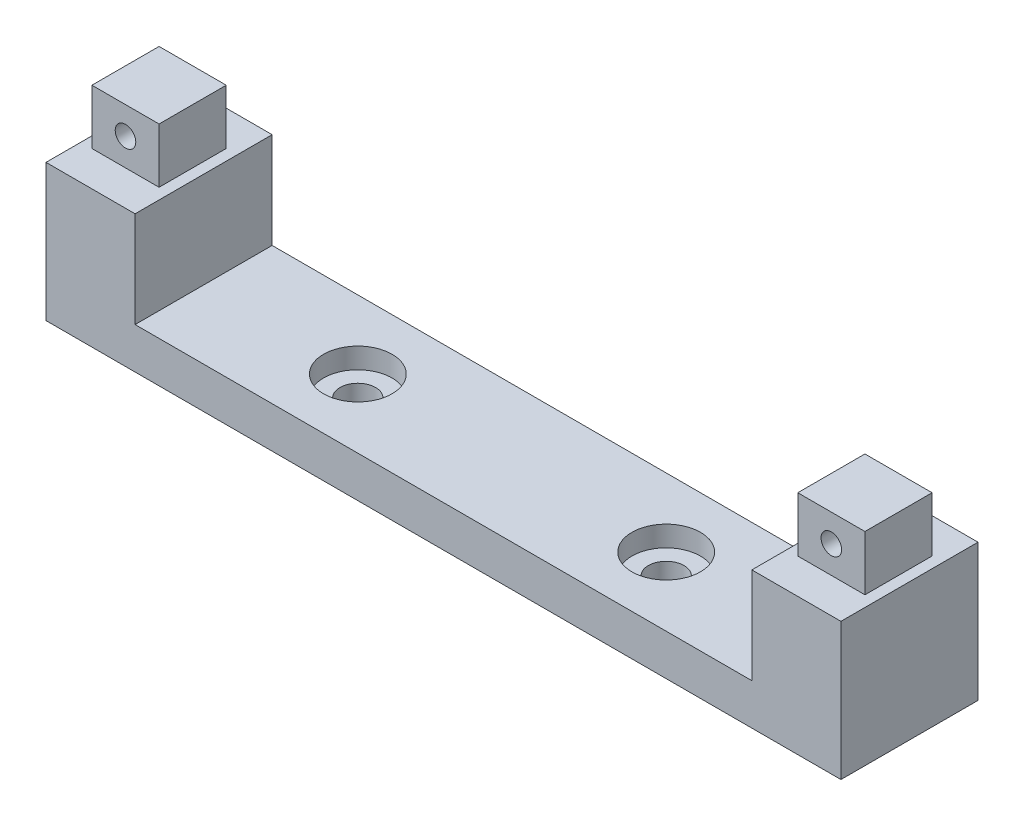
ISO-10303-21;
HEADER;
FILE_DESCRIPTION(('STEP AP214'),'2;1');
FILE_NAME('part.step','',(''),(''),'','','');
FILE_SCHEMA(('AUTOMOTIVE_DESIGN { 1 0 10303 214 1 1 1 1 }'));
ENDSEC;
DATA;
#1=APPLICATION_CONTEXT('core data for automotive mechanical design processes');
#2=APPLICATION_PROTOCOL_DEFINITION('international standard','automotive_design',2000,#1);
#3=PRODUCT_CONTEXT('',#1,'mechanical');
#4=PRODUCT('Part','Part','',(#3));
#5=PRODUCT_RELATED_PRODUCT_CATEGORY('part','',(#4));
#6=PRODUCT_DEFINITION_FORMATION('','',#4);
#7=PRODUCT_DEFINITION_CONTEXT('part definition',#1,'design');
#8=PRODUCT_DEFINITION('design','',#6,#7);
#9=PRODUCT_DEFINITION_SHAPE('','',#8);
#10=(LENGTH_UNIT() NAMED_UNIT(*) SI_UNIT(.MILLI.,.METRE.));
#11=(NAMED_UNIT(*) PLANE_ANGLE_UNIT() SI_UNIT($,.RADIAN.));
#12=(NAMED_UNIT(*) SI_UNIT($,.STERADIAN.) SOLID_ANGLE_UNIT());
#13=UNCERTAINTY_MEASURE_WITH_UNIT(LENGTH_MEASURE(1.E-05),#10,'distance_accuracy_value','');
#14=(GEOMETRIC_REPRESENTATION_CONTEXT(3) GLOBAL_UNCERTAINTY_ASSIGNED_CONTEXT((#13)) GLOBAL_UNIT_ASSIGNED_CONTEXT((#10,
#11,#12)) REPRESENTATION_CONTEXT('',''));
#15=CARTESIAN_POINT('',(0.,0.,0.));
#16=DIRECTION('',(0.,0.,1.));
#17=DIRECTION('',(1.,0.,0.));
#18=AXIS2_PLACEMENT_3D('',#15,#16,#17);
#19=CARTESIAN_POINT('',(-2.50000000000001,-8.,10.));
#20=DIRECTION('',(0.,1.,0.));
#21=DIRECTION('',(0.,0.,1.));
#22=AXIS2_PLACEMENT_3D('',#19,#20,#21);
#23=CYLINDRICAL_SURFACE('',#22,2.6);
#24=CARTESIAN_POINT('',(-2.50000000000001,6.,10.));
#25=DIRECTION('',(0.,-1.,0.));
#26=DIRECTION('',(0.,0.,-1.));
#27=AXIS2_PLACEMENT_3D('',#24,#25,#26);
#28=CIRCLE('',#27,2.6);
#29=CARTESIAN_POINT('',(-2.50000000000001,6.,7.4));
#30=VERTEX_POINT('',#29);
#31=EDGE_CURVE('E261',#30,#30,#28,.T.);
#32=ORIENTED_EDGE('',*,*,#31,.T.);
#33=EDGE_LOOP('',(#32));
#34=FACE_BOUND('',#33,.T.);
#35=CARTESIAN_POINT('',(-2.50000000000001,9.,10.));
#36=DIRECTION('',(0.,1.,0.));
#37=DIRECTION('',(0.,0.,1.));
#38=AXIS2_PLACEMENT_3D('',#35,#36,#37);
#39=CIRCLE('',#38,2.6);
#40=CARTESIAN_POINT('',(-2.50000000000001,9.,12.6));
#41=VERTEX_POINT('',#40);
#42=EDGE_CURVE('E43',#41,#41,#39,.F.);
#43=ORIENTED_EDGE('',*,*,#42,.F.);
#44=EDGE_LOOP('',(#43));
#45=FACE_BOUND('',#44,.T.);
#46=ADVANCED_FACE('F39',(#34,#45),#23,.F.);
#47=CARTESIAN_POINT('',(-47.5,-8.,10.));
#48=DIRECTION('',(0.,1.,0.));
#49=DIRECTION('',(0.,0.,1.));
#50=AXIS2_PLACEMENT_3D('',#47,#48,#49);
#51=CYLINDRICAL_SURFACE('',#50,2.6);
#52=CARTESIAN_POINT('',(-47.5,6.,10.));
#53=DIRECTION('',(0.,-1.,0.));
#54=DIRECTION('',(0.,0.,-1.));
#55=AXIS2_PLACEMENT_3D('',#52,#53,#54);
#56=CIRCLE('',#55,2.6);
#57=CARTESIAN_POINT('',(-47.5,6.,7.4));
#58=VERTEX_POINT('',#57);
#59=EDGE_CURVE('E165',#58,#58,#56,.T.);
#60=ORIENTED_EDGE('',*,*,#59,.T.);
#61=EDGE_LOOP('',(#60));
#62=FACE_BOUND('',#61,.T.);
#63=CARTESIAN_POINT('',(-47.5,9.,10.));
#64=DIRECTION('',(0.,1.,0.));
#65=DIRECTION('',(0.,0.,1.));
#66=AXIS2_PLACEMENT_3D('',#63,#64,#65);
#67=CIRCLE('',#66,2.6);
#68=CARTESIAN_POINT('',(-47.5,9.,12.6));
#69=VERTEX_POINT('',#68);
#70=EDGE_CURVE('E255',#69,#69,#67,.F.);
#71=ORIENTED_EDGE('',*,*,#70,.F.);
#72=EDGE_LOOP('',(#71));
#73=FACE_BOUND('',#72,.T.);
#74=ADVANCED_FACE('F358',(#62,#73),#51,.F.);
#75=CARTESIAN_POINT('',(0.,6.,20.));
#76=DIRECTION('',(0.,0.,-1.));
#77=DIRECTION('',(-1.,0.,0.));
#78=AXIS2_PLACEMENT_3D('',#75,#76,#77);
#79=PLANE('',#78);
#80=DIRECTION('',(-1.,0.,0.));
#81=VECTOR('',#80,1.);
#82=CARTESIAN_POINT('',(0.,6.,20.));
#83=LINE('',#82,#81);
#84=CARTESIAN_POINT('',(33.,6.,20.));
#85=VERTEX_POINT('',#84);
#86=CARTESIAN_POINT('',(-83.,6.,20.));
#87=VERTEX_POINT('',#86);
#88=EDGE_CURVE('E11',#85,#87,#83,.T.);
#89=ORIENTED_EDGE('',*,*,#88,.F.);
#90=DIRECTION('',(0.,1.,0.));
#91=VECTOR('',#90,1.);
#92=CARTESIAN_POINT('',(33.,0.,20.));
#93=LINE('',#92,#91);
#94=CARTESIAN_POINT('',(33.,26.,20.));
#95=VERTEX_POINT('',#94);
#96=EDGE_CURVE('E195',#85,#95,#93,.T.);
#97=ORIENTED_EDGE('',*,*,#96,.T.);
#98=DIRECTION('',(1.,0.,0.));
#99=VECTOR('',#98,1.);
#100=CARTESIAN_POINT('',(0.,26.,20.));
#101=LINE('',#100,#99);
#102=CARTESIAN_POINT('',(20.,26.,20.));
#103=VERTEX_POINT('',#102);
#104=EDGE_CURVE('E204',#103,#95,#101,.T.);
#105=ORIENTED_EDGE('',*,*,#104,.F.);
#106=DIRECTION('',(0.,-1.,0.));
#107=VECTOR('',#106,1.);
#108=CARTESIAN_POINT('',(20.,26.,20.));
#109=LINE('',#108,#107);
#110=CARTESIAN_POINT('',(20.,12.,20.));
#111=VERTEX_POINT('',#110);
#112=EDGE_CURVE('E206',#103,#111,#109,.T.);
#113=ORIENTED_EDGE('',*,*,#112,.T.);
#114=DIRECTION('',(1.,0.,0.));
#115=VECTOR('',#114,1.);
#116=CARTESIAN_POINT('',(20.,12.,20.));
#117=LINE('',#116,#115);
#118=CARTESIAN_POINT('',(-70.,12.,20.));
#119=VERTEX_POINT('',#118);
#120=EDGE_CURVE('E188',#119,#111,#117,.T.);
#121=ORIENTED_EDGE('',*,*,#120,.F.);
#122=DIRECTION('',(0.,1.,0.));
#123=VECTOR('',#122,1.);
#124=CARTESIAN_POINT('',(-70.,6.,20.));
#125=LINE('',#124,#123);
#126=CARTESIAN_POINT('',(-70.,26.,20.));
#127=VERTEX_POINT('',#126);
#128=EDGE_CURVE('E174',#119,#127,#125,.T.);
#129=ORIENTED_EDGE('',*,*,#128,.T.);
#130=DIRECTION('',(-1.,0.,0.));
#131=VECTOR('',#130,1.);
#132=CARTESIAN_POINT('',(-70.,26.,20.));
#133=LINE('',#132,#131);
#134=CARTESIAN_POINT('',(-83.,26.,20.));
#135=VERTEX_POINT('',#134);
#136=EDGE_CURVE('E169',#127,#135,#133,.T.);
#137=ORIENTED_EDGE('',*,*,#136,.T.);
#138=DIRECTION('',(0.,-1.,0.));
#139=VECTOR('',#138,1.);
#140=CARTESIAN_POINT('',(-83.,26.,20.));
#141=LINE('',#140,#139);
#142=EDGE_CURVE('E160',#135,#87,#141,.T.);
#143=ORIENTED_EDGE('',*,*,#142,.T.);
#144=EDGE_LOOP('',(#89,#97,#105,#113,#121,#129,#137,#143));
#145=FACE_BOUND('',#144,.T.);
#146=ADVANCED_FACE('F167',(#145),#79,.F.);
#147=CARTESIAN_POINT('',(0.,6.,0.));
#148=DIRECTION('',(0.,0.,1.));
#149=DIRECTION('',(1.,0.,0.));
#150=AXIS2_PLACEMENT_3D('',#147,#148,#149);
#151=PLANE('',#150);
#152=DIRECTION('',(-1.,0.,0.));
#153=VECTOR('',#152,1.);
#154=CARTESIAN_POINT('',(0.,6.,0.));
#155=LINE('',#154,#153);
#156=CARTESIAN_POINT('',(33.,6.,0.));
#157=VERTEX_POINT('',#156);
#158=CARTESIAN_POINT('',(-83.,6.,0.));
#159=VERTEX_POINT('',#158);
#160=EDGE_CURVE('E208',#157,#159,#155,.T.);
#161=ORIENTED_EDGE('',*,*,#160,.T.);
#162=DIRECTION('',(0.,-1.,0.));
#163=VECTOR('',#162,1.);
#164=CARTESIAN_POINT('',(-83.,26.,0.));
#165=LINE('',#164,#163);
#166=CARTESIAN_POINT('',(-83.,26.,0.));
#167=VERTEX_POINT('',#166);
#168=EDGE_CURVE('E163',#167,#159,#165,.T.);
#169=ORIENTED_EDGE('',*,*,#168,.F.);
#170=DIRECTION('',(-1.,0.,0.));
#171=VECTOR('',#170,1.);
#172=CARTESIAN_POINT('',(-70.,26.,0.));
#173=LINE('',#172,#171);
#174=CARTESIAN_POINT('',(-70.,26.,0.));
#175=VERTEX_POINT('',#174);
#176=EDGE_CURVE('E172',#175,#167,#173,.T.);
#177=ORIENTED_EDGE('',*,*,#176,.F.);
#178=DIRECTION('',(0.,1.,0.));
#179=VECTOR('',#178,1.);
#180=CARTESIAN_POINT('',(-70.,6.,0.));
#181=LINE('',#180,#179);
#182=CARTESIAN_POINT('',(-70.,12.,0.));
#183=VERTEX_POINT('',#182);
#184=EDGE_CURVE('E170',#183,#175,#181,.T.);
#185=ORIENTED_EDGE('',*,*,#184,.F.);
#186=DIRECTION('',(1.,0.,0.));
#187=VECTOR('',#186,1.);
#188=CARTESIAN_POINT('',(20.,12.,0.));
#189=LINE('',#188,#187);
#190=CARTESIAN_POINT('',(20.,12.,0.));
#191=VERTEX_POINT('',#190);
#192=EDGE_CURVE('E180',#183,#191,#189,.T.);
#193=ORIENTED_EDGE('',*,*,#192,.T.);
#194=DIRECTION('',(0.,-1.,0.));
#195=VECTOR('',#194,1.);
#196=CARTESIAN_POINT('',(20.,26.,0.));
#197=LINE('',#196,#195);
#198=CARTESIAN_POINT('',(20.,26.,0.));
#199=VERTEX_POINT('',#198);
#200=EDGE_CURVE('E209',#199,#191,#197,.T.);
#201=ORIENTED_EDGE('',*,*,#200,.F.);
#202=DIRECTION('',(-1.,0.,0.));
#203=VECTOR('',#202,1.);
#204=CARTESIAN_POINT('',(0.,26.,0.));
#205=LINE('',#204,#203);
#206=CARTESIAN_POINT('',(33.,26.,0.));
#207=VERTEX_POINT('',#206);
#208=EDGE_CURVE('E213',#207,#199,#205,.T.);
#209=ORIENTED_EDGE('',*,*,#208,.F.);
#210=DIRECTION('',(0.,1.,0.));
#211=VECTOR('',#210,1.);
#212=CARTESIAN_POINT('',(33.,0.,0.));
#213=LINE('',#212,#211);
#214=EDGE_CURVE('E202',#157,#207,#213,.T.);
#215=ORIENTED_EDGE('',*,*,#214,.F.);
#216=EDGE_LOOP('',(#161,#169,#177,#185,#193,#201,#209,#215));
#217=FACE_BOUND('',#216,.T.);
#218=ADVANCED_FACE('F325',(#217),#151,.F.);
#219=CARTESIAN_POINT('',(33.,0.,0.));
#220=DIRECTION('',(-1.,0.,0.));
#221=DIRECTION('',(0.,0.,1.));
#222=AXIS2_PLACEMENT_3D('',#219,#220,#221);
#223=PLANE('',#222);
#224=DIRECTION('',(0.,0.,-1.));
#225=VECTOR('',#224,1.);
#226=CARTESIAN_POINT('',(33.,6.,20.));
#227=LINE('',#226,#225);
#228=EDGE_CURVE('E63',#85,#157,#227,.T.);
#229=ORIENTED_EDGE('',*,*,#228,.T.);
#230=ORIENTED_EDGE('',*,*,#214,.T.);
#231=DIRECTION('',(0.,0.,-1.));
#232=VECTOR('',#231,1.);
#233=CARTESIAN_POINT('',(33.,26.,0.));
#234=LINE('',#233,#232);
#235=EDGE_CURVE('E216',#95,#207,#234,.T.);
#236=ORIENTED_EDGE('',*,*,#235,.F.);
#237=ORIENTED_EDGE('',*,*,#96,.F.);
#238=EDGE_LOOP('',(#229,#230,#236,#237));
#239=FACE_BOUND('',#238,.T.);
#240=ADVANCED_FACE('F329',(#239),#223,.F.);
#241=CARTESIAN_POINT('',(0.,26.,0.));
#242=DIRECTION('',(0.,1.,0.));
#243=DIRECTION('',(0.,0.,1.));
#244=AXIS2_PLACEMENT_3D('',#241,#242,#243);
#245=PLANE('',#244);
#246=DIRECTION('',(0.,0.,-1.));
#247=VECTOR('',#246,1.);
#248=CARTESIAN_POINT('',(20.,26.,0.));
#249=LINE('',#248,#247);
#250=EDGE_CURVE('E212',#103,#199,#249,.T.);
#251=ORIENTED_EDGE('',*,*,#250,.F.);
#252=ORIENTED_EDGE('',*,*,#104,.T.);
#253=ORIENTED_EDGE('',*,*,#235,.T.);
#254=ORIENTED_EDGE('',*,*,#208,.T.);
#255=EDGE_LOOP('',(#251,#252,#253,#254));
#256=FACE_BOUND('',#255,.T.);
#257=DIRECTION('',(1.,0.,0.));
#258=VECTOR('',#257,1.);
#259=CARTESIAN_POINT('',(0.,26.,14.9));
#260=LINE('',#259,#258);
#261=CARTESIAN_POINT('',(21.6,26.,14.9));
#262=VERTEX_POINT('',#261);
#263=CARTESIAN_POINT('',(31.4,26.,14.9));
#264=VERTEX_POINT('',#263);
#265=EDGE_CURVE('E228',#262,#264,#260,.T.);
#266=ORIENTED_EDGE('',*,*,#265,.F.);
#267=DIRECTION('',(0.,0.,-1.));
#268=VECTOR('',#267,1.);
#269=CARTESIAN_POINT('',(21.6,26.,0.));
#270=LINE('',#269,#268);
#271=CARTESIAN_POINT('',(21.6,26.,5.1));
#272=VERTEX_POINT('',#271);
#273=EDGE_CURVE('E215',#262,#272,#270,.T.);
#274=ORIENTED_EDGE('',*,*,#273,.T.);
#275=DIRECTION('',(1.,0.,0.));
#276=VECTOR('',#275,1.);
#277=CARTESIAN_POINT('',(0.,26.,5.1));
#278=LINE('',#277,#276);
#279=CARTESIAN_POINT('',(31.4,26.,5.1));
#280=VERTEX_POINT('',#279);
#281=EDGE_CURVE('E223',#272,#280,#278,.T.);
#282=ORIENTED_EDGE('',*,*,#281,.T.);
#283=DIRECTION('',(0.,0.,-1.));
#284=VECTOR('',#283,1.);
#285=CARTESIAN_POINT('',(31.4,26.,0.));
#286=LINE('',#285,#284);
#287=EDGE_CURVE('E227',#264,#280,#286,.T.);
#288=ORIENTED_EDGE('',*,*,#287,.F.);
#289=EDGE_LOOP('',(#266,#274,#282,#288));
#290=FACE_BOUND('',#289,.T.);
#291=ADVANCED_FACE('F334',(#256,#290),#245,.T.);
#292=CARTESIAN_POINT('',(20.,26.,0.));
#293=DIRECTION('',(-1.,0.,0.));
#294=DIRECTION('',(0.,0.,1.));
#295=AXIS2_PLACEMENT_3D('',#292,#293,#294);
#296=PLANE('',#295);
#297=DIRECTION('',(0.,0.,-1.));
#298=VECTOR('',#297,1.);
#299=CARTESIAN_POINT('',(20.,12.,20.));
#300=LINE('',#299,#298);
#301=EDGE_CURVE('E56',#111,#191,#300,.T.);
#302=ORIENTED_EDGE('',*,*,#301,.F.);
#303=ORIENTED_EDGE('',*,*,#112,.F.);
#304=ORIENTED_EDGE('',*,*,#250,.T.);
#305=ORIENTED_EDGE('',*,*,#200,.T.);
#306=EDGE_LOOP('',(#302,#303,#304,#305));
#307=FACE_BOUND('',#306,.T.);
#308=ADVANCED_FACE('F337',(#307),#296,.T.);
#309=CARTESIAN_POINT('',(21.6,34.,0.));
#310=DIRECTION('',(-1.,0.,0.));
#311=DIRECTION('',(0.,0.,1.));
#312=AXIS2_PLACEMENT_3D('',#309,#310,#311);
#313=PLANE('',#312);
#314=ORIENTED_EDGE('',*,*,#273,.F.);
#315=DIRECTION('',(0.,-1.,0.));
#316=VECTOR('',#315,1.);
#317=CARTESIAN_POINT('',(21.6,34.,14.9));
#318=LINE('',#317,#316);
#319=CARTESIAN_POINT('',(21.6,34.,14.9));
#320=VERTEX_POINT('',#319);
#321=EDGE_CURVE('E224',#320,#262,#318,.T.);
#322=ORIENTED_EDGE('',*,*,#321,.F.);
#323=DIRECTION('',(0.,0.,-1.));
#324=VECTOR('',#323,1.);
#325=CARTESIAN_POINT('',(21.6,34.,0.));
#326=LINE('',#325,#324);
#327=CARTESIAN_POINT('',(21.6,34.,5.1));
#328=VERTEX_POINT('',#327);
#329=EDGE_CURVE('E211',#320,#328,#326,.T.);
#330=ORIENTED_EDGE('',*,*,#329,.T.);
#331=DIRECTION('',(0.,-1.,0.));
#332=VECTOR('',#331,1.);
#333=CARTESIAN_POINT('',(21.6,34.,5.1));
#334=LINE('',#333,#332);
#335=EDGE_CURVE('E237',#328,#272,#334,.T.);
#336=ORIENTED_EDGE('',*,*,#335,.T.);
#337=EDGE_LOOP('',(#314,#322,#330,#336));
#338=FACE_BOUND('',#337,.T.);
#339=ADVANCED_FACE('F536',(#338),#313,.T.);
#340=CARTESIAN_POINT('',(0.,34.,14.9));
#341=DIRECTION('',(0.,0.,-1.));
#342=DIRECTION('',(-1.,0.,0.));
#343=AXIS2_PLACEMENT_3D('',#340,#341,#342);
#344=PLANE('',#343);
#345=CARTESIAN_POINT('',(26.5,30.,14.9));
#346=DIRECTION('',(0.,0.,1.));
#347=DIRECTION('',(1.,0.,0.));
#348=AXIS2_PLACEMENT_3D('',#345,#346,#347);
#349=CIRCLE('',#348,1.5);
#350=CARTESIAN_POINT('',(28.,30.,14.9));
#351=VERTEX_POINT('',#350);
#352=EDGE_CURVE('E48',#351,#351,#349,.T.);
#353=ORIENTED_EDGE('',*,*,#352,.F.);
#354=EDGE_LOOP('',(#353));
#355=FACE_BOUND('',#354,.T.);
#356=ORIENTED_EDGE('',*,*,#265,.T.);
#357=DIRECTION('',(0.,-1.,0.));
#358=VECTOR('',#357,1.);
#359=CARTESIAN_POINT('',(31.4,34.,14.9));
#360=LINE('',#359,#358);
#361=CARTESIAN_POINT('',(31.4,34.,14.9));
#362=VERTEX_POINT('',#361);
#363=EDGE_CURVE('E229',#362,#264,#360,.T.);
#364=ORIENTED_EDGE('',*,*,#363,.F.);
#365=DIRECTION('',(1.,0.,0.));
#366=VECTOR('',#365,1.);
#367=CARTESIAN_POINT('',(0.,34.,14.9));
#368=LINE('',#367,#366);
#369=EDGE_CURVE('E236',#320,#362,#368,.T.);
#370=ORIENTED_EDGE('',*,*,#369,.F.);
#371=ORIENTED_EDGE('',*,*,#321,.T.);
#372=EDGE_LOOP('',(#356,#364,#370,#371));
#373=FACE_BOUND('',#372,.T.);
#374=ADVANCED_FACE('F526',(#355,#373),#344,.F.);
#375=CARTESIAN_POINT('',(31.4,34.,0.));
#376=DIRECTION('',(-1.,0.,0.));
#377=DIRECTION('',(0.,0.,1.));
#378=AXIS2_PLACEMENT_3D('',#375,#376,#377);
#379=PLANE('',#378);
#380=ORIENTED_EDGE('',*,*,#287,.T.);
#381=DIRECTION('',(0.,-1.,0.));
#382=VECTOR('',#381,1.);
#383=CARTESIAN_POINT('',(31.4,34.,5.1));
#384=LINE('',#383,#382);
#385=CARTESIAN_POINT('',(31.4,34.,5.1));
#386=VERTEX_POINT('',#385);
#387=EDGE_CURVE('E233',#386,#280,#384,.T.);
#388=ORIENTED_EDGE('',*,*,#387,.F.);
#389=DIRECTION('',(0.,0.,-1.));
#390=VECTOR('',#389,1.);
#391=CARTESIAN_POINT('',(31.4,34.,0.));
#392=LINE('',#391,#390);
#393=EDGE_CURVE('E201',#362,#386,#392,.T.);
#394=ORIENTED_EDGE('',*,*,#393,.F.);
#395=ORIENTED_EDGE('',*,*,#363,.T.);
#396=EDGE_LOOP('',(#380,#388,#394,#395));
#397=FACE_BOUND('',#396,.T.);
#398=ADVANCED_FACE('F515',(#397),#379,.F.);
#399=CARTESIAN_POINT('',(0.,34.,5.1));
#400=DIRECTION('',(0.,0.,-1.));
#401=DIRECTION('',(-1.,0.,0.));
#402=AXIS2_PLACEMENT_3D('',#399,#400,#401);
#403=PLANE('',#402);
#404=CARTESIAN_POINT('',(26.5,30.,5.1));
#405=DIRECTION('',(0.,0.,-1.));
#406=DIRECTION('',(-1.,0.,0.));
#407=AXIS2_PLACEMENT_3D('',#404,#405,#406);
#408=CIRCLE('',#407,1.5);
#409=CARTESIAN_POINT('',(25.,30.,5.1));
#410=VERTEX_POINT('',#409);
#411=EDGE_CURVE('E198',#410,#410,#408,.T.);
#412=ORIENTED_EDGE('',*,*,#411,.F.);
#413=EDGE_LOOP('',(#412));
#414=FACE_BOUND('',#413,.T.);
#415=ORIENTED_EDGE('',*,*,#281,.F.);
#416=ORIENTED_EDGE('',*,*,#335,.F.);
#417=DIRECTION('',(1.,0.,0.));
#418=VECTOR('',#417,1.);
#419=CARTESIAN_POINT('',(0.,34.,5.1));
#420=LINE('',#419,#418);
#421=EDGE_CURVE('E232',#328,#386,#420,.T.);
#422=ORIENTED_EDGE('',*,*,#421,.T.);
#423=ORIENTED_EDGE('',*,*,#387,.T.);
#424=EDGE_LOOP('',(#415,#416,#422,#423));
#425=FACE_BOUND('',#424,.T.);
#426=ADVANCED_FACE('F504',(#414,#425),#403,.T.);
#427=CARTESIAN_POINT('',(0.,34.,0.));
#428=DIRECTION('',(0.,1.,0.));
#429=DIRECTION('',(0.,0.,1.));
#430=AXIS2_PLACEMENT_3D('',#427,#428,#429);
#431=PLANE('',#430);
#432=ORIENTED_EDGE('',*,*,#329,.F.);
#433=ORIENTED_EDGE('',*,*,#369,.T.);
#434=ORIENTED_EDGE('',*,*,#393,.T.);
#435=ORIENTED_EDGE('',*,*,#421,.F.);
#436=EDGE_LOOP('',(#432,#433,#434,#435));
#437=FACE_BOUND('',#436,.T.);
#438=ADVANCED_FACE('F492',(#437),#431,.T.);
#439=CARTESIAN_POINT('',(26.5,30.,4.9));
#440=DIRECTION('',(0.,0.,1.));
#441=DIRECTION('',(1.,0.,0.));
#442=AXIS2_PLACEMENT_3D('',#439,#440,#441);
#443=CYLINDRICAL_SURFACE('',#442,1.5);
#444=ORIENTED_EDGE('',*,*,#411,.T.);
#445=EDGE_LOOP('',(#444));
#446=FACE_BOUND('',#445,.T.);
#447=ORIENTED_EDGE('',*,*,#352,.T.);
#448=EDGE_LOOP('',(#447));
#449=FACE_BOUND('',#448,.T.);
#450=ADVANCED_FACE('F351',(#446,#449),#443,.F.);
#451=CARTESIAN_POINT('',(0.,6.,20.));
#452=DIRECTION('',(0.,-1.,0.));
#453=DIRECTION('',(0.,0.,-1.));
#454=AXIS2_PLACEMENT_3D('',#451,#452,#453);
#455=PLANE('',#454);
#456=ORIENTED_EDGE('',*,*,#59,.F.);
#457=EDGE_LOOP('',(#456));
#458=FACE_BOUND('',#457,.T.);
#459=ORIENTED_EDGE('',*,*,#31,.F.);
#460=EDGE_LOOP('',(#459));
#461=FACE_BOUND('',#460,.T.);
#462=ORIENTED_EDGE('',*,*,#160,.F.);
#463=ORIENTED_EDGE('',*,*,#228,.F.);
#464=ORIENTED_EDGE('',*,*,#88,.T.);
#465=DIRECTION('',(0.,0.,-1.));
#466=VECTOR('',#465,1.);
#467=CARTESIAN_POINT('',(-83.,6.,20.));
#468=LINE('',#467,#466);
#469=EDGE_CURVE('E152',#87,#159,#468,.T.);
#470=ORIENTED_EDGE('',*,*,#469,.T.);
#471=EDGE_LOOP('',(#462,#463,#464,#470));
#472=FACE_BOUND('',#471,.T.);
#473=ADVANCED_FACE('F41',(#458,#461,#472),#455,.T.);
#474=CARTESIAN_POINT('',(20.,12.,20.));
#475=DIRECTION('',(0.,1.,0.));
#476=DIRECTION('',(0.,0.,1.));
#477=AXIS2_PLACEMENT_3D('',#474,#475,#476);
#478=PLANE('',#477);
#479=CARTESIAN_POINT('',(-47.5,12.,10.));
#480=DIRECTION('',(0.,1.,0.));
#481=DIRECTION('',(0.,0.,1.));
#482=AXIS2_PLACEMENT_3D('',#479,#480,#481);
#483=CIRCLE('',#482,5.);
#484=CARTESIAN_POINT('',(-47.5,12.,15.));
#485=VERTEX_POINT('',#484);
#486=EDGE_CURVE('E263',#485,#485,#483,.T.);
#487=ORIENTED_EDGE('',*,*,#486,.F.);
#488=EDGE_LOOP('',(#487));
#489=FACE_BOUND('',#488,.T.);
#490=CARTESIAN_POINT('',(-2.50000000000001,12.,10.));
#491=DIRECTION('',(0.,1.,0.));
#492=DIRECTION('',(0.,0.,1.));
#493=AXIS2_PLACEMENT_3D('',#490,#491,#492);
#494=CIRCLE('',#493,5.);
#495=CARTESIAN_POINT('',(-2.50000000000001,12.,15.));
#496=VERTEX_POINT('',#495);
#497=EDGE_CURVE('E273',#496,#496,#494,.T.);
#498=ORIENTED_EDGE('',*,*,#497,.F.);
#499=EDGE_LOOP('',(#498));
#500=FACE_BOUND('',#499,.T.);
#501=ORIENTED_EDGE('',*,*,#192,.F.);
#502=DIRECTION('',(0.,0.,-1.));
#503=VECTOR('',#502,1.);
#504=CARTESIAN_POINT('',(-70.,12.,20.));
#505=LINE('',#504,#503);
#506=EDGE_CURVE('E191',#119,#183,#505,.T.);
#507=ORIENTED_EDGE('',*,*,#506,.F.);
#508=ORIENTED_EDGE('',*,*,#120,.T.);
#509=ORIENTED_EDGE('',*,*,#301,.T.);
#510=EDGE_LOOP('',(#501,#507,#508,#509));
#511=FACE_BOUND('',#510,.T.);
#512=ADVANCED_FACE('F339',(#489,#500,#511),#478,.T.);
#513=CARTESIAN_POINT('',(-76.5,30.,4.9));
#514=DIRECTION('',(0.,0.,1.));
#515=DIRECTION('',(1.,0.,0.));
#516=AXIS2_PLACEMENT_3D('',#513,#514,#515);
#517=CYLINDRICAL_SURFACE('',#516,1.5);
#518=CARTESIAN_POINT('',(-76.5,30.,5.1));
#519=DIRECTION('',(0.,0.,-1.));
#520=DIRECTION('',(-1.,0.,0.));
#521=AXIS2_PLACEMENT_3D('',#518,#519,#520);
#522=CIRCLE('',#521,1.5);
#523=CARTESIAN_POINT('',(-78.,30.,5.1));
#524=VERTEX_POINT('',#523);
#525=EDGE_CURVE('E184',#524,#524,#522,.T.);
#526=ORIENTED_EDGE('',*,*,#525,.T.);
#527=EDGE_LOOP('',(#526));
#528=FACE_BOUND('',#527,.T.);
#529=CARTESIAN_POINT('',(-76.5,30.,14.9));
#530=DIRECTION('',(0.,0.,1.));
#531=DIRECTION('',(1.,0.,0.));
#532=AXIS2_PLACEMENT_3D('',#529,#530,#531);
#533=CIRCLE('',#532,1.5);
#534=CARTESIAN_POINT('',(-75.,30.,14.9));
#535=VERTEX_POINT('',#534);
#536=EDGE_CURVE('E164',#535,#535,#533,.T.);
#537=ORIENTED_EDGE('',*,*,#536,.T.);
#538=EDGE_LOOP('',(#537));
#539=FACE_BOUND('',#538,.T.);
#540=ADVANCED_FACE('F341',(#528,#539),#517,.F.);
#541=CARTESIAN_POINT('',(0.,34.,0.));
#542=DIRECTION('',(0.,1.,0.));
#543=DIRECTION('',(0.,0.,1.));
#544=AXIS2_PLACEMENT_3D('',#541,#542,#543);
#545=PLANE('',#544);
#546=DIRECTION('',(0.,0.,-1.));
#547=VECTOR('',#546,1.);
#548=CARTESIAN_POINT('',(-81.4,34.,0.));
#549=LINE('',#548,#547);
#550=CARTESIAN_POINT('',(-81.4,34.,14.9));
#551=VERTEX_POINT('',#550);
#552=CARTESIAN_POINT('',(-81.4,34.,5.1));
#553=VERTEX_POINT('',#552);
#554=EDGE_CURVE('E282',#551,#553,#549,.T.);
#555=ORIENTED_EDGE('',*,*,#554,.F.);
#556=DIRECTION('',(1.,0.,0.));
#557=VECTOR('',#556,1.);
#558=CARTESIAN_POINT('',(0.,34.,14.9));
#559=LINE('',#558,#557);
#560=CARTESIAN_POINT('',(-71.6,34.,14.9));
#561=VERTEX_POINT('',#560);
#562=EDGE_CURVE('E285',#551,#561,#559,.T.);
#563=ORIENTED_EDGE('',*,*,#562,.T.);
#564=DIRECTION('',(0.,0.,-1.));
#565=VECTOR('',#564,1.);
#566=CARTESIAN_POINT('',(-71.6,34.,0.));
#567=LINE('',#566,#565);
#568=CARTESIAN_POINT('',(-71.6,34.,5.1));
#569=VERTEX_POINT('',#568);
#570=EDGE_CURVE('E288',#561,#569,#567,.T.);
#571=ORIENTED_EDGE('',*,*,#570,.T.);
#572=DIRECTION('',(1.,0.,0.));
#573=VECTOR('',#572,1.);
#574=CARTESIAN_POINT('',(0.,34.,5.1));
#575=LINE('',#574,#573);
#576=EDGE_CURVE('E290',#553,#569,#575,.T.);
#577=ORIENTED_EDGE('',*,*,#576,.F.);
#578=EDGE_LOOP('',(#555,#563,#571,#577));
#579=FACE_BOUND('',#578,.T.);
#580=ADVANCED_FACE('F348',(#579),#545,.T.);
#581=CARTESIAN_POINT('',(0.,34.,14.9));
#582=DIRECTION('',(0.,0.,-1.));
#583=DIRECTION('',(-1.,0.,0.));
#584=AXIS2_PLACEMENT_3D('',#581,#582,#583);
#585=PLANE('',#584);
#586=ORIENTED_EDGE('',*,*,#536,.F.);
#587=EDGE_LOOP('',(#586));
#588=FACE_BOUND('',#587,.T.);
#589=DIRECTION('',(1.,0.,0.));
#590=VECTOR('',#589,1.);
#591=CARTESIAN_POINT('',(0.,26.,14.9));
#592=LINE('',#591,#590);
#593=CARTESIAN_POINT('',(-81.4,26.,14.9));
#594=VERTEX_POINT('',#593);
#595=CARTESIAN_POINT('',(-71.6,26.,14.9));
#596=VERTEX_POINT('',#595);
#597=EDGE_CURVE('E295',#594,#596,#592,.T.);
#598=ORIENTED_EDGE('',*,*,#597,.T.);
#599=DIRECTION('',(0.,-1.,0.));
#600=VECTOR('',#599,1.);
#601=CARTESIAN_POINT('',(-71.6,34.,14.9));
#602=LINE('',#601,#600);
#603=EDGE_CURVE('E307',#561,#596,#602,.T.);
#604=ORIENTED_EDGE('',*,*,#603,.F.);
#605=ORIENTED_EDGE('',*,*,#562,.F.);
#606=DIRECTION('',(0.,-1.,0.));
#607=VECTOR('',#606,1.);
#608=CARTESIAN_POINT('',(-81.4,34.,14.9));
#609=LINE('',#608,#607);
#610=EDGE_CURVE('E310',#551,#594,#609,.T.);
#611=ORIENTED_EDGE('',*,*,#610,.T.);
#612=EDGE_LOOP('',(#598,#604,#605,#611));
#613=FACE_BOUND('',#612,.T.);
#614=ADVANCED_FACE('F371',(#588,#613),#585,.F.);
#615=CARTESIAN_POINT('',(-71.6,34.,0.));
#616=DIRECTION('',(-1.,0.,0.));
#617=DIRECTION('',(0.,0.,1.));
#618=AXIS2_PLACEMENT_3D('',#615,#616,#617);
#619=PLANE('',#618);
#620=DIRECTION('',(0.,0.,-1.));
#621=VECTOR('',#620,1.);
#622=CARTESIAN_POINT('',(-71.6,26.,0.));
#623=LINE('',#622,#621);
#624=CARTESIAN_POINT('',(-71.6,26.,5.1));
#625=VERTEX_POINT('',#624);
#626=EDGE_CURVE('E298',#596,#625,#623,.T.);
#627=ORIENTED_EDGE('',*,*,#626,.T.);
#628=DIRECTION('',(0.,-1.,0.));
#629=VECTOR('',#628,1.);
#630=CARTESIAN_POINT('',(-71.6,34.,5.1));
#631=LINE('',#630,#629);
#632=EDGE_CURVE('E304',#569,#625,#631,.T.);
#633=ORIENTED_EDGE('',*,*,#632,.F.);
#634=ORIENTED_EDGE('',*,*,#570,.F.);
#635=ORIENTED_EDGE('',*,*,#603,.T.);
#636=EDGE_LOOP('',(#627,#633,#634,#635));
#637=FACE_BOUND('',#636,.T.);
#638=ADVANCED_FACE('F377',(#637),#619,.F.);
#639=CARTESIAN_POINT('',(0.,34.,5.1));
#640=DIRECTION('',(0.,0.,-1.));
#641=DIRECTION('',(-1.,0.,0.));
#642=AXIS2_PLACEMENT_3D('',#639,#640,#641);
#643=PLANE('',#642);
#644=ORIENTED_EDGE('',*,*,#525,.F.);
#645=EDGE_LOOP('',(#644));
#646=FACE_BOUND('',#645,.T.);
#647=DIRECTION('',(1.,0.,0.));
#648=VECTOR('',#647,1.);
#649=CARTESIAN_POINT('',(0.,26.,5.1));
#650=LINE('',#649,#648);
#651=CARTESIAN_POINT('',(-81.4,26.,5.1));
#652=VERTEX_POINT('',#651);
#653=EDGE_CURVE('E286',#652,#625,#650,.T.);
#654=ORIENTED_EDGE('',*,*,#653,.F.);
#655=DIRECTION('',(0.,-1.,0.));
#656=VECTOR('',#655,1.);
#657=CARTESIAN_POINT('',(-81.4,34.,5.1));
#658=LINE('',#657,#656);
#659=EDGE_CURVE('E293',#553,#652,#658,.T.);
#660=ORIENTED_EDGE('',*,*,#659,.F.);
#661=ORIENTED_EDGE('',*,*,#576,.T.);
#662=ORIENTED_EDGE('',*,*,#632,.T.);
#663=EDGE_LOOP('',(#654,#660,#661,#662));
#664=FACE_BOUND('',#663,.T.);
#665=ADVANCED_FACE('F373',(#646,#664),#643,.T.);
#666=CARTESIAN_POINT('',(-81.4,34.,0.));
#667=DIRECTION('',(-1.,0.,0.));
#668=DIRECTION('',(0.,0.,1.));
#669=AXIS2_PLACEMENT_3D('',#666,#667,#668);
#670=PLANE('',#669);
#671=DIRECTION('',(0.,0.,-1.));
#672=VECTOR('',#671,1.);
#673=CARTESIAN_POINT('',(-81.4,26.,0.));
#674=LINE('',#673,#672);
#675=EDGE_CURVE('E187',#594,#652,#674,.T.);
#676=ORIENTED_EDGE('',*,*,#675,.F.);
#677=ORIENTED_EDGE('',*,*,#610,.F.);
#678=ORIENTED_EDGE('',*,*,#554,.T.);
#679=ORIENTED_EDGE('',*,*,#659,.T.);
#680=EDGE_LOOP('',(#676,#677,#678,#679));
#681=FACE_BOUND('',#680,.T.);
#682=ADVANCED_FACE('F376',(#681),#670,.T.);
#683=CARTESIAN_POINT('',(-70.,26.,0.));
#684=DIRECTION('',(0.,1.,0.));
#685=DIRECTION('',(0.,0.,1.));
#686=AXIS2_PLACEMENT_3D('',#683,#684,#685);
#687=PLANE('',#686);
#688=ORIENTED_EDGE('',*,*,#675,.T.);
#689=ORIENTED_EDGE('',*,*,#653,.T.);
#690=ORIENTED_EDGE('',*,*,#626,.F.);
#691=ORIENTED_EDGE('',*,*,#597,.F.);
#692=EDGE_LOOP('',(#688,#689,#690,#691));
#693=FACE_BOUND('',#692,.T.);
#694=ORIENTED_EDGE('',*,*,#136,.F.);
#695=DIRECTION('',(0.,0.,1.));
#696=VECTOR('',#695,1.);
#697=CARTESIAN_POINT('',(-70.,26.,0.));
#698=LINE('',#697,#696);
#699=EDGE_CURVE('E181',#175,#127,#698,.T.);
#700=ORIENTED_EDGE('',*,*,#699,.F.);
#701=ORIENTED_EDGE('',*,*,#176,.T.);
#702=DIRECTION('',(0.,0.,1.));
#703=VECTOR('',#702,1.);
#704=CARTESIAN_POINT('',(-83.,26.,0.));
#705=LINE('',#704,#703);
#706=EDGE_CURVE('E178',#167,#135,#705,.T.);
#707=ORIENTED_EDGE('',*,*,#706,.T.);
#708=EDGE_LOOP('',(#694,#700,#701,#707));
#709=FACE_BOUND('',#708,.T.);
#710=ADVANCED_FACE('F323',(#693,#709),#687,.T.);
#711=CARTESIAN_POINT('',(-70.,6.,0.));
#712=DIRECTION('',(1.,0.,0.));
#713=DIRECTION('',(0.,0.,-1.));
#714=AXIS2_PLACEMENT_3D('',#711,#712,#713);
#715=PLANE('',#714);
#716=ORIENTED_EDGE('',*,*,#128,.F.);
#717=ORIENTED_EDGE('',*,*,#506,.T.);
#718=ORIENTED_EDGE('',*,*,#184,.T.);
#719=ORIENTED_EDGE('',*,*,#699,.T.);
#720=EDGE_LOOP('',(#716,#717,#718,#719));
#721=FACE_BOUND('',#720,.T.);
#722=ADVANCED_FACE('F319',(#721),#715,.T.);
#723=CARTESIAN_POINT('',(-83.,26.,0.));
#724=DIRECTION('',(-1.,0.,0.));
#725=DIRECTION('',(0.,0.,1.));
#726=AXIS2_PLACEMENT_3D('',#723,#724,#725);
#727=PLANE('',#726);
#728=ORIENTED_EDGE('',*,*,#168,.T.);
#729=ORIENTED_EDGE('',*,*,#469,.F.);
#730=ORIENTED_EDGE('',*,*,#142,.F.);
#731=ORIENTED_EDGE('',*,*,#706,.F.);
#732=EDGE_LOOP('',(#728,#729,#730,#731));
#733=FACE_BOUND('',#732,.T.);
#734=ADVANCED_FACE('F159',(#733),#727,.T.);
#735=CARTESIAN_POINT('',(-47.5,9.,10.));
#736=DIRECTION('',(0.,1.,0.));
#737=DIRECTION('',(0.,0.,1.));
#738=AXIS2_PLACEMENT_3D('',#735,#736,#737);
#739=PLANE('',#738);
#740=CARTESIAN_POINT('',(-47.5,9.,10.));
#741=DIRECTION('',(0.,1.,0.));
#742=DIRECTION('',(0.,0.,1.));
#743=AXIS2_PLACEMENT_3D('',#740,#741,#742);
#744=CIRCLE('',#743,5.);
#745=CARTESIAN_POINT('',(-47.5,9.,15.));
#746=VERTEX_POINT('',#745);
#747=EDGE_CURVE('E257',#746,#746,#744,.T.);
#748=ORIENTED_EDGE('',*,*,#747,.T.);
#749=EDGE_LOOP('',(#748));
#750=FACE_BOUND('',#749,.T.);
#751=ORIENTED_EDGE('',*,*,#70,.T.);
#752=EDGE_LOOP('',(#751));
#753=FACE_BOUND('',#752,.T.);
#754=ADVANCED_FACE('F390',(#750,#753),#739,.T.);
#755=CARTESIAN_POINT('',(-47.5,9.,10.));
#756=DIRECTION('',(0.,1.,0.));
#757=DIRECTION('',(0.,0.,1.));
#758=AXIS2_PLACEMENT_3D('',#755,#756,#757);
#759=CYLINDRICAL_SURFACE('',#758,5.);
#760=ORIENTED_EDGE('',*,*,#747,.F.);
#761=EDGE_LOOP('',(#760));
#762=FACE_BOUND('',#761,.T.);
#763=ORIENTED_EDGE('',*,*,#486,.T.);
#764=EDGE_LOOP('',(#763));
#765=FACE_BOUND('',#764,.T.);
#766=ADVANCED_FACE('F409',(#762,#765),#759,.F.);
#767=CARTESIAN_POINT('',(-2.50000000000001,9.,10.));
#768=DIRECTION('',(0.,1.,0.));
#769=DIRECTION('',(0.,0.,1.));
#770=AXIS2_PLACEMENT_3D('',#767,#768,#769);
#771=PLANE('',#770);
#772=CARTESIAN_POINT('',(-2.50000000000001,9.,10.));
#773=DIRECTION('',(0.,1.,0.));
#774=DIRECTION('',(0.,0.,1.));
#775=AXIS2_PLACEMENT_3D('',#772,#773,#774);
#776=CIRCLE('',#775,5.);
#777=CARTESIAN_POINT('',(-2.50000000000001,9.,15.));
#778=VERTEX_POINT('',#777);
#779=EDGE_CURVE('E268',#778,#778,#776,.T.);
#780=ORIENTED_EDGE('',*,*,#779,.T.);
#781=EDGE_LOOP('',(#780));
#782=FACE_BOUND('',#781,.T.);
#783=ORIENTED_EDGE('',*,*,#42,.T.);
#784=EDGE_LOOP('',(#783));
#785=FACE_BOUND('',#784,.T.);
#786=ADVANCED_FACE('F416',(#782,#785),#771,.T.);
#787=CARTESIAN_POINT('',(-2.50000000000001,9.,10.));
#788=DIRECTION('',(0.,1.,0.));
#789=DIRECTION('',(0.,0.,1.));
#790=AXIS2_PLACEMENT_3D('',#787,#788,#789);
#791=CYLINDRICAL_SURFACE('',#790,5.);
#792=ORIENTED_EDGE('',*,*,#779,.F.);
#793=EDGE_LOOP('',(#792));
#794=FACE_BOUND('',#793,.T.);
#795=ORIENTED_EDGE('',*,*,#497,.T.);
#796=EDGE_LOOP('',(#795));
#797=FACE_BOUND('',#796,.T.);
#798=ADVANCED_FACE('F424',(#794,#797),#791,.F.);
#799=CLOSED_SHELL('',(#46,#74,#146,#218,#240,#291,#308,#339,#374,#398,#426,#438,#450,#473,#512,
#540,#580,#614,#638,#665,#682,#710,#722,#734,#754,#766,#786,#798));
#800=MANIFOLD_SOLID_BREP('B2',#799);
#801=ADVANCED_BREP_SHAPE_REPRESENTATION('',(#18,#800),#14);
#802=SHAPE_DEFINITION_REPRESENTATION(#9,#801);
ENDSEC;
END-ISO-10303-21;
